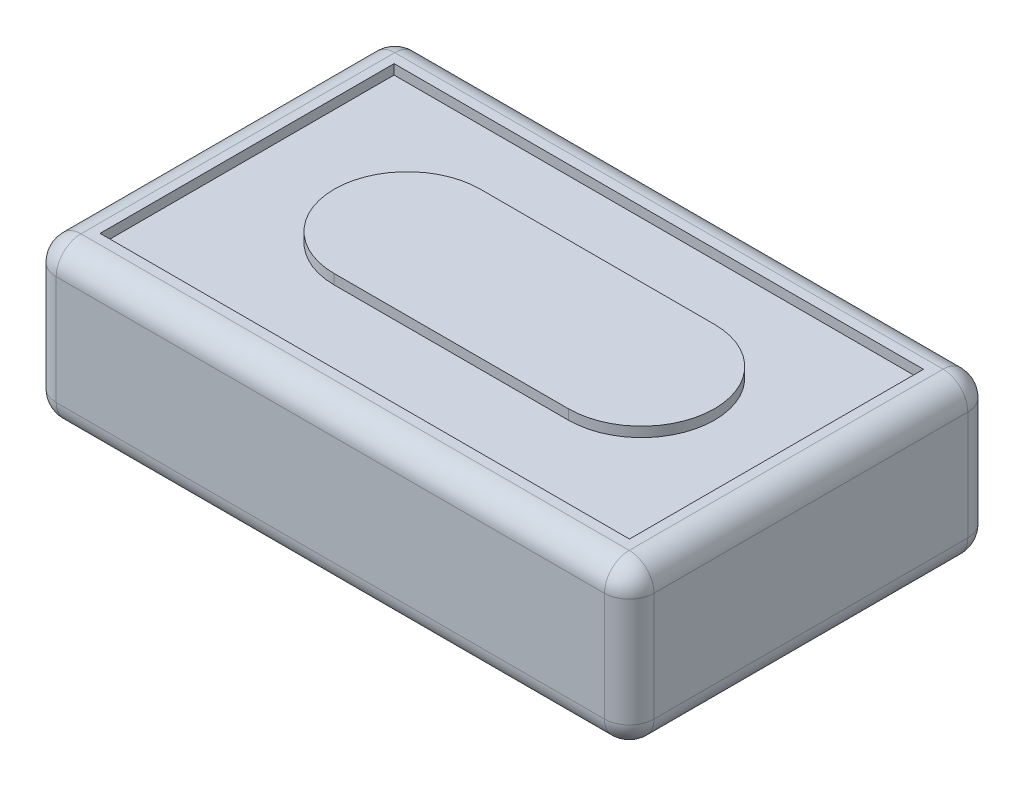
ISO-10303-21;
HEADER;
FILE_DESCRIPTION(('STEP AP214'),'2;1');
FILE_NAME('part.step','',(''),(''),'','','');
FILE_SCHEMA(('AUTOMOTIVE_DESIGN { 1 0 10303 214 1 1 1 1 }'));
ENDSEC;
DATA;
#1=APPLICATION_CONTEXT('core data for automotive mechanical design processes');
#2=APPLICATION_PROTOCOL_DEFINITION('international standard','automotive_design',2000,#1);
#3=PRODUCT_CONTEXT('',#1,'mechanical');
#4=PRODUCT('Part','Part','',(#3));
#5=PRODUCT_RELATED_PRODUCT_CATEGORY('part','',(#4));
#6=PRODUCT_DEFINITION_FORMATION('','',#4);
#7=PRODUCT_DEFINITION_CONTEXT('part definition',#1,'design');
#8=PRODUCT_DEFINITION('design','',#6,#7);
#9=PRODUCT_DEFINITION_SHAPE('','',#8);
#10=(LENGTH_UNIT() NAMED_UNIT(*) SI_UNIT(.MILLI.,.METRE.));
#11=(NAMED_UNIT(*) PLANE_ANGLE_UNIT() SI_UNIT($,.RADIAN.));
#12=(NAMED_UNIT(*) SI_UNIT($,.STERADIAN.) SOLID_ANGLE_UNIT());
#13=UNCERTAINTY_MEASURE_WITH_UNIT(LENGTH_MEASURE(1.E-05),#10,'distance_accuracy_value','');
#14=(GEOMETRIC_REPRESENTATION_CONTEXT(3) GLOBAL_UNCERTAINTY_ASSIGNED_CONTEXT((#13)) GLOBAL_UNIT_ASSIGNED_CONTEXT((#10,
#11,#12)) REPRESENTATION_CONTEXT('',''));
#15=CARTESIAN_POINT('',(0.,0.,0.));
#16=DIRECTION('',(0.,0.,1.));
#17=DIRECTION('',(1.,0.,0.));
#18=AXIS2_PLACEMENT_3D('',#15,#16,#17);
#19=CARTESIAN_POINT('',(0.,30.,0.));
#20=DIRECTION('',(0.,1.,0.));
#21=DIRECTION('',(0.,0.,1.));
#22=AXIS2_PLACEMENT_3D('',#19,#20,#21);
#23=PLANE('',#22);
#24=DIRECTION('',(0.,0.,1.));
#25=VECTOR('',#24,1.);
#26=CARTESIAN_POINT('',(-66.0378786462378,30.,-35.6672184226131));
#27=LINE('',#26,#25);
#28=CARTESIAN_POINT('',(-66.0378786462378,30.,-35.6672184226131));
#29=VERTEX_POINT('',#28);
#30=CARTESIAN_POINT('',(-66.0378786462378,30.,23.697300393735));
#31=VERTEX_POINT('',#30);
#32=EDGE_CURVE('E301',#29,#31,#27,.T.);
#33=ORIENTED_EDGE('',*,*,#32,.T.);
#34=DIRECTION('',(1.,0.,0.));
#35=VECTOR('',#34,1.);
#36=CARTESIAN_POINT('',(-66.0378786462378,30.,23.697300393735));
#37=LINE('',#36,#35);
#38=CARTESIAN_POINT('',(40.8587080469138,30.,23.697300393735));
#39=VERTEX_POINT('',#38);
#40=EDGE_CURVE('E305',#31,#39,#37,.T.);
#41=ORIENTED_EDGE('',*,*,#40,.T.);
#42=DIRECTION('',(0.,0.,-1.));
#43=VECTOR('',#42,1.);
#44=CARTESIAN_POINT('',(40.8587080469138,30.,-35.6672184226131));
#45=LINE('',#44,#43);
#46=CARTESIAN_POINT('',(40.8587080469138,30.,-35.6672184226131));
#47=VERTEX_POINT('',#46);
#48=EDGE_CURVE('E310',#39,#47,#45,.T.);
#49=ORIENTED_EDGE('',*,*,#48,.T.);
#50=DIRECTION('',(-1.,0.,0.));
#51=VECTOR('',#50,1.);
#52=CARTESIAN_POINT('',(-66.0378786462378,30.,-35.6672184226131));
#53=LINE('',#52,#51);
#54=EDGE_CURVE('E314',#47,#29,#53,.T.);
#55=ORIENTED_EDGE('',*,*,#54,.T.);
#56=EDGE_LOOP('',(#33,#41,#49,#55));
#57=FACE_BOUND('',#56,.T.);
#58=DIRECTION('',(1.,0.,0.));
#59=VECTOR('',#58,1.);
#60=CARTESIAN_POINT('',(-35.3748816628657,30.,7.08033888595775));
#61=LINE('',#60,#59);
#62=CARTESIAN_POINT('',(-35.3748816628657,30.,7.08033888595775));
#63=VERTEX_POINT('',#62);
#64=CARTESIAN_POINT('',(11.9074393021383,30.,7.08033888595775));
#65=VERTEX_POINT('',#64);
#66=EDGE_CURVE('E70',#63,#65,#61,.T.);
#67=ORIENTED_EDGE('',*,*,#66,.F.);
#68=CARTESIAN_POINT('',(-35.3748816628657,30.,-7.66977857279566));
#69=DIRECTION('',(0.,1.,0.));
#70=DIRECTION('',(0.,0.,1.));
#71=AXIS2_PLACEMENT_3D('',#68,#69,#70);
#72=CIRCLE('',#71,14.7501174587534);
#73=CARTESIAN_POINT('',(-35.3748816628657,30.,-22.4198960315491));
#74=VERTEX_POINT('',#73);
#75=EDGE_CURVE('E253',#74,#63,#72,.T.);
#76=ORIENTED_EDGE('',*,*,#75,.F.);
#77=DIRECTION('',(1.,0.,0.));
#78=VECTOR('',#77,1.);
#79=CARTESIAN_POINT('',(-35.3748816628657,30.,-22.4198960315491));
#80=LINE('',#79,#78);
#81=CARTESIAN_POINT('',(11.9074393021383,30.,-22.4198960315491));
#82=VERTEX_POINT('',#81);
#83=EDGE_CURVE('E264',#74,#82,#80,.T.);
#84=ORIENTED_EDGE('',*,*,#83,.T.);
#85=CARTESIAN_POINT('',(11.9074393021383,30.,-7.66977857279566));
#86=DIRECTION('',(0.,1.,0.));
#87=DIRECTION('',(0.,0.,1.));
#88=AXIS2_PLACEMENT_3D('',#85,#86,#87);
#89=CIRCLE('',#88,14.7501174587534);
#90=EDGE_CURVE('E280',#65,#82,#89,.T.);
#91=ORIENTED_EDGE('',*,*,#90,.F.);
#92=EDGE_LOOP('',(#67,#76,#84,#91));
#93=FACE_BOUND('',#92,.T.);
#94=ADVANCED_FACE('F44',(#57,#93),#23,.T.);
#95=CARTESIAN_POINT('',(-72.8912329218107,32.,30.7033810699589));
#96=DIRECTION('',(0.,0.,-1.));
#97=DIRECTION('',(-1.,0.,0.));
#98=AXIS2_PLACEMENT_3D('',#95,#96,#97);
#99=PLANE('',#98);
#100=DIRECTION('',(1.,0.,0.));
#101=VECTOR('',#100,1.);
#102=CARTESIAN_POINT('',(-72.8912329218107,27.,30.7033810699589));
#103=LINE('',#102,#101);
#104=CARTESIAN_POINT('',(42.8128987654321,27.,30.7033810699589));
#105=VERTEX_POINT('',#104);
#106=CARTESIAN_POINT('',(-67.8912329218107,27.,30.7033810699589));
#107=VERTEX_POINT('',#106);
#108=EDGE_CURVE('E377',#105,#107,#103,.F.);
#109=ORIENTED_EDGE('',*,*,#108,.T.);
#110=DIRECTION('',(0.,-1.,0.));
#111=VECTOR('',#110,1.);
#112=CARTESIAN_POINT('',(-67.8912329218107,32.,30.7033810699589));
#113=LINE('',#112,#111);
#114=CARTESIAN_POINT('',(-67.8912329218107,5.,30.7033810699589));
#115=VERTEX_POINT('',#114);
#116=EDGE_CURVE('E380',#107,#115,#113,.T.);
#117=ORIENTED_EDGE('',*,*,#116,.T.);
#118=DIRECTION('',(1.,0.,0.));
#119=VECTOR('',#118,1.);
#120=CARTESIAN_POINT('',(47.8128987654321,5.,30.7033810699589));
#121=LINE('',#120,#119);
#122=CARTESIAN_POINT('',(42.8128987654321,5.,30.7033810699589));
#123=VERTEX_POINT('',#122);
#124=EDGE_CURVE('E374',#115,#123,#121,.T.);
#125=ORIENTED_EDGE('',*,*,#124,.T.);
#126=DIRECTION('',(0.,-1.,0.));
#127=VECTOR('',#126,1.);
#128=CARTESIAN_POINT('',(42.8128987654321,32.,30.7033810699589));
#129=LINE('',#128,#127);
#130=EDGE_CURVE('E371',#123,#105,#129,.F.);
#131=ORIENTED_EDGE('',*,*,#130,.T.);
#132=EDGE_LOOP('',(#109,#117,#125,#131));
#133=FACE_BOUND('',#132,.T.);
#134=ADVANCED_FACE('F589',(#133),#99,.F.);
#135=CARTESIAN_POINT('',(47.8128987654321,32.,-42.6566057613168));
#136=DIRECTION('',(1.,0.,0.));
#137=DIRECTION('',(0.,0.,-1.));
#138=AXIS2_PLACEMENT_3D('',#135,#136,#137);
#139=PLANE('',#138);
#140=DIRECTION('',(0.,0.,1.));
#141=VECTOR('',#140,1.);
#142=CARTESIAN_POINT('',(47.8128987654321,27.,30.7033810699589));
#143=LINE('',#142,#141);
#144=CARTESIAN_POINT('',(47.8128987654321,27.,-37.6566057613168));
#145=VERTEX_POINT('',#144);
#146=CARTESIAN_POINT('',(47.8128987654321,27.,25.7033810699589));
#147=VERTEX_POINT('',#146);
#148=EDGE_CURVE('E54',#145,#147,#143,.T.);
#149=ORIENTED_EDGE('',*,*,#148,.T.);
#150=DIRECTION('',(0.,-1.,0.));
#151=VECTOR('',#150,1.);
#152=CARTESIAN_POINT('',(47.8128987654321,0.,25.7033810699589));
#153=LINE('',#152,#151);
#154=CARTESIAN_POINT('',(47.8128987654321,5.,25.7033810699589));
#155=VERTEX_POINT('',#154);
#156=EDGE_CURVE('E11',#147,#155,#153,.T.);
#157=ORIENTED_EDGE('',*,*,#156,.T.);
#158=DIRECTION('',(0.,0.,1.));
#159=VECTOR('',#158,1.);
#160=CARTESIAN_POINT('',(47.8128987654321,5.,-42.6566057613168));
#161=LINE('',#160,#159);
#162=CARTESIAN_POINT('',(47.8128987654321,5.,-37.6566057613168));
#163=VERTEX_POINT('',#162);
#164=EDGE_CURVE('E410',#155,#163,#161,.F.);
#165=ORIENTED_EDGE('',*,*,#164,.T.);
#166=DIRECTION('',(0.,-1.,0.));
#167=VECTOR('',#166,1.);
#168=CARTESIAN_POINT('',(47.8128987654321,32.,-37.6566057613168));
#169=LINE('',#168,#167);
#170=EDGE_CURVE('E413',#163,#145,#169,.F.);
#171=ORIENTED_EDGE('',*,*,#170,.T.);
#172=EDGE_LOOP('',(#149,#157,#165,#171));
#173=FACE_BOUND('',#172,.T.);
#174=ADVANCED_FACE('F532',(#173),#139,.T.);
#175=CARTESIAN_POINT('',(-72.8912329218107,32.,-42.6566057613168));
#176=DIRECTION('',(0.,0.,-1.));
#177=DIRECTION('',(-1.,0.,0.));
#178=AXIS2_PLACEMENT_3D('',#175,#176,#177);
#179=PLANE('',#178);
#180=DIRECTION('',(0.,-1.,0.));
#181=VECTOR('',#180,1.);
#182=CARTESIAN_POINT('',(-67.8912329218107,32.,-42.6566057613168));
#183=LINE('',#182,#181);
#184=CARTESIAN_POINT('',(-67.8912329218107,5.,-42.6566057613168));
#185=VERTEX_POINT('',#184);
#186=CARTESIAN_POINT('',(-67.8912329218107,27.,-42.6566057613168));
#187=VERTEX_POINT('',#186);
#188=EDGE_CURVE('E403',#185,#187,#183,.F.);
#189=ORIENTED_EDGE('',*,*,#188,.T.);
#190=DIRECTION('',(1.,0.,0.));
#191=VECTOR('',#190,1.);
#192=CARTESIAN_POINT('',(47.8128987654321,27.,-42.6566057613168));
#193=LINE('',#192,#191);
#194=CARTESIAN_POINT('',(42.8128987654321,27.,-42.6566057613168));
#195=VERTEX_POINT('',#194);
#196=EDGE_CURVE('E406',#187,#195,#193,.T.);
#197=ORIENTED_EDGE('',*,*,#196,.T.);
#198=DIRECTION('',(0.,-1.,0.));
#199=VECTOR('',#198,1.);
#200=CARTESIAN_POINT('',(42.8128987654321,32.,-42.6566057613168));
#201=LINE('',#200,#199);
#202=CARTESIAN_POINT('',(42.8128987654321,5.,-42.6566057613168));
#203=VERTEX_POINT('',#202);
#204=EDGE_CURVE('E397',#195,#203,#201,.T.);
#205=ORIENTED_EDGE('',*,*,#204,.T.);
#206=DIRECTION('',(1.,0.,0.));
#207=VECTOR('',#206,1.);
#208=CARTESIAN_POINT('',(-72.8912329218107,5.,-42.6566057613168));
#209=LINE('',#208,#207);
#210=EDGE_CURVE('E400',#203,#185,#209,.F.);
#211=ORIENTED_EDGE('',*,*,#210,.T.);
#212=EDGE_LOOP('',(#189,#197,#205,#211));
#213=FACE_BOUND('',#212,.T.);
#214=ADVANCED_FACE('F523',(#213),#179,.T.);
#215=CARTESIAN_POINT('',(-72.8912329218107,32.,-42.6566057613168));
#216=DIRECTION('',(1.,0.,0.));
#217=DIRECTION('',(0.,0.,-1.));
#218=AXIS2_PLACEMENT_3D('',#215,#216,#217);
#219=PLANE('',#218);
#220=DIRECTION('',(0.,-1.,0.));
#221=VECTOR('',#220,1.);
#222=CARTESIAN_POINT('',(-72.8912329218107,32.,25.7033810699589));
#223=LINE('',#222,#221);
#224=CARTESIAN_POINT('',(-72.8912329218107,5.,25.7033810699589));
#225=VERTEX_POINT('',#224);
#226=CARTESIAN_POINT('',(-72.8912329218107,27.,25.7033810699589));
#227=VERTEX_POINT('',#226);
#228=EDGE_CURVE('E364',#225,#227,#223,.F.);
#229=ORIENTED_EDGE('',*,*,#228,.T.);
#230=DIRECTION('',(0.,0.,1.));
#231=VECTOR('',#230,1.);
#232=CARTESIAN_POINT('',(-72.8912329218107,27.,-42.6566057613168));
#233=LINE('',#232,#231);
#234=CARTESIAN_POINT('',(-72.8912329218107,27.,-37.6566057613168));
#235=VERTEX_POINT('',#234);
#236=EDGE_CURVE('E367',#227,#235,#233,.F.);
#237=ORIENTED_EDGE('',*,*,#236,.T.);
#238=DIRECTION('',(0.,-1.,0.));
#239=VECTOR('',#238,1.);
#240=CARTESIAN_POINT('',(-72.8912329218107,0.,-37.6566057613168));
#241=LINE('',#240,#239);
#242=CARTESIAN_POINT('',(-72.8912329218107,5.,-37.6566057613168));
#243=VERTEX_POINT('',#242);
#244=EDGE_CURVE('E358',#235,#243,#241,.T.);
#245=ORIENTED_EDGE('',*,*,#244,.T.);
#246=DIRECTION('',(0.,0.,1.));
#247=VECTOR('',#246,1.);
#248=CARTESIAN_POINT('',(-72.8912329218107,5.,30.7033810699589));
#249=LINE('',#248,#247);
#250=EDGE_CURVE('E361',#243,#225,#249,.T.);
#251=ORIENTED_EDGE('',*,*,#250,.T.);
#252=EDGE_LOOP('',(#229,#237,#245,#251));
#253=FACE_BOUND('',#252,.T.);
#254=ADVANCED_FACE('F621',(#253),#219,.F.);
#255=CARTESIAN_POINT('',(0.,32.,0.));
#256=DIRECTION('',(0.,-1.,0.));
#257=DIRECTION('',(0.,0.,-1.));
#258=AXIS2_PLACEMENT_3D('',#255,#256,#257);
#259=PLANE('',#258);
#260=DIRECTION('',(1.,0.,0.));
#261=VECTOR('',#260,1.);
#262=CARTESIAN_POINT('',(-66.0378786462378,32.,23.697300393735));
#263=LINE('',#262,#261);
#264=CARTESIAN_POINT('',(-66.0378786462378,32.,23.697300393735));
#265=VERTEX_POINT('',#264);
#266=CARTESIAN_POINT('',(40.8587080469138,32.,23.697300393735));
#267=VERTEX_POINT('',#266);
#268=EDGE_CURVE('E321',#265,#267,#263,.T.);
#269=ORIENTED_EDGE('',*,*,#268,.F.);
#270=DIRECTION('',(0.,0.,1.));
#271=VECTOR('',#270,1.);
#272=CARTESIAN_POINT('',(-66.0378786462378,32.,-35.6672184226131));
#273=LINE('',#272,#271);
#274=CARTESIAN_POINT('',(-66.0378786462378,32.,-35.6672184226131));
#275=VERTEX_POINT('',#274);
#276=EDGE_CURVE('E300',#275,#265,#273,.T.);
#277=ORIENTED_EDGE('',*,*,#276,.F.);
#278=DIRECTION('',(-1.,0.,0.));
#279=VECTOR('',#278,1.);
#280=CARTESIAN_POINT('',(-66.0378786462378,32.,-35.6672184226131));
#281=LINE('',#280,#279);
#282=CARTESIAN_POINT('',(40.8587080469138,32.,-35.6672184226131));
#283=VERTEX_POINT('',#282);
#284=EDGE_CURVE('E306',#283,#275,#281,.T.);
#285=ORIENTED_EDGE('',*,*,#284,.F.);
#286=DIRECTION('',(0.,0.,-1.));
#287=VECTOR('',#286,1.);
#288=CARTESIAN_POINT('',(40.8587080469138,32.,-35.6672184226131));
#289=LINE('',#288,#287);
#290=EDGE_CURVE('E325',#267,#283,#289,.T.);
#291=ORIENTED_EDGE('',*,*,#290,.F.);
#292=EDGE_LOOP('',(#269,#277,#285,#291));
#293=FACE_BOUND('',#292,.T.);
#294=DIRECTION('',(1.,0.,0.));
#295=VECTOR('',#294,1.);
#296=CARTESIAN_POINT('',(-72.8912329218107,32.,-37.6566057613168));
#297=LINE('',#296,#295);
#298=CARTESIAN_POINT('',(42.8128987654321,32.,-37.6566057613168));
#299=VERTEX_POINT('',#298);
#300=CARTESIAN_POINT('',(-67.8912329218107,32.,-37.6566057613168));
#301=VERTEX_POINT('',#300);
#302=EDGE_CURVE('E348',#299,#301,#297,.F.);
#303=ORIENTED_EDGE('',*,*,#302,.T.);
#304=DIRECTION('',(0.,0.,1.));
#305=VECTOR('',#304,1.);
#306=CARTESIAN_POINT('',(-67.8912329218107,32.,0.));
#307=LINE('',#306,#305);
#308=CARTESIAN_POINT('',(-67.8912329218107,32.,25.7033810699589));
#309=VERTEX_POINT('',#308);
#310=EDGE_CURVE('E354',#301,#309,#307,.T.);
#311=ORIENTED_EDGE('',*,*,#310,.T.);
#312=DIRECTION('',(1.,0.,0.));
#313=VECTOR('',#312,1.);
#314=CARTESIAN_POINT('',(0.,32.,25.7033810699589));
#315=LINE('',#314,#313);
#316=CARTESIAN_POINT('',(42.8128987654321,32.,25.7033810699589));
#317=VERTEX_POINT('',#316);
#318=EDGE_CURVE('E351',#309,#317,#315,.T.);
#319=ORIENTED_EDGE('',*,*,#318,.T.);
#320=DIRECTION('',(0.,0.,1.));
#321=VECTOR('',#320,1.);
#322=CARTESIAN_POINT('',(42.8128987654321,32.,-42.6566057613168));
#323=LINE('',#322,#321);
#324=EDGE_CURVE('E345',#317,#299,#323,.F.);
#325=ORIENTED_EDGE('',*,*,#324,.T.);
#326=EDGE_LOOP('',(#303,#311,#319,#325));
#327=FACE_BOUND('',#326,.T.);
#328=ADVANCED_FACE('F618',(#293,#327),#259,.F.);
#329=CARTESIAN_POINT('',(0.,0.,0.));
#330=DIRECTION('',(0.,-1.,0.));
#331=DIRECTION('',(0.,0.,-1.));
#332=AXIS2_PLACEMENT_3D('',#329,#330,#331);
#333=PLANE('',#332);
#334=DIRECTION('',(0.,0.,-1.));
#335=VECTOR('',#334,1.);
#336=CARTESIAN_POINT('',(-66.1540366843682,0.,23.8031666764886));
#337=LINE('',#336,#335);
#338=CARTESIAN_POINT('',(-66.1540366843682,0.,23.8031666764886));
#339=VERTEX_POINT('',#338);
#340=CARTESIAN_POINT('',(-66.1540366843682,0.,-35.7253025064288));
#341=VERTEX_POINT('',#340);
#342=EDGE_CURVE('E62',#339,#341,#337,.T.);
#343=ORIENTED_EDGE('',*,*,#342,.F.);
#344=DIRECTION('',(-1.,0.,0.));
#345=VECTOR('',#344,1.);
#346=CARTESIAN_POINT('',(-66.1540366843682,0.,23.8031666764886));
#347=LINE('',#346,#345);
#348=CARTESIAN_POINT('',(41.1210844637195,0.,23.8031666764886));
#349=VERTEX_POINT('',#348);
#350=EDGE_CURVE('E231',#349,#339,#347,.T.);
#351=ORIENTED_EDGE('',*,*,#350,.F.);
#352=DIRECTION('',(0.,0.,1.));
#353=VECTOR('',#352,1.);
#354=CARTESIAN_POINT('',(41.1210844637195,0.,23.8031666764886));
#355=LINE('',#354,#353);
#356=CARTESIAN_POINT('',(41.1210844637195,0.,-35.7253025064288));
#357=VERTEX_POINT('',#356);
#358=EDGE_CURVE('E235',#357,#349,#355,.T.);
#359=ORIENTED_EDGE('',*,*,#358,.F.);
#360=DIRECTION('',(1.,0.,0.));
#361=VECTOR('',#360,1.);
#362=CARTESIAN_POINT('',(-66.1540366843682,0.,-35.7253025064288));
#363=LINE('',#362,#361);
#364=EDGE_CURVE('E244',#341,#357,#363,.T.);
#365=ORIENTED_EDGE('',*,*,#364,.F.);
#366=EDGE_LOOP('',(#343,#351,#359,#365));
#367=FACE_BOUND('',#366,.T.);
#368=DIRECTION('',(1.,0.,0.));
#369=VECTOR('',#368,1.);
#370=CARTESIAN_POINT('',(-72.8912329218107,0.,25.7033810699589));
#371=LINE('',#370,#369);
#372=CARTESIAN_POINT('',(42.8128987654321,0.,25.7033810699589));
#373=VERTEX_POINT('',#372);
#374=CARTESIAN_POINT('',(-67.8912329218107,0.,25.7033810699589));
#375=VERTEX_POINT('',#374);
#376=EDGE_CURVE('E390',#373,#375,#371,.F.);
#377=ORIENTED_EDGE('',*,*,#376,.T.);
#378=DIRECTION('',(0.,0.,1.));
#379=VECTOR('',#378,1.);
#380=CARTESIAN_POINT('',(-67.8912329218107,0.,-42.6566057613168));
#381=LINE('',#380,#379);
#382=CARTESIAN_POINT('',(-67.8912329218107,0.,-37.6566057613168));
#383=VERTEX_POINT('',#382);
#384=EDGE_CURVE('E393',#375,#383,#381,.F.);
#385=ORIENTED_EDGE('',*,*,#384,.T.);
#386=DIRECTION('',(1.,0.,0.));
#387=VECTOR('',#386,1.);
#388=CARTESIAN_POINT('',(0.,0.,-37.6566057613168));
#389=LINE('',#388,#387);
#390=CARTESIAN_POINT('',(42.8128987654321,0.,-37.6566057613168));
#391=VERTEX_POINT('',#390);
#392=EDGE_CURVE('E387',#383,#391,#389,.T.);
#393=ORIENTED_EDGE('',*,*,#392,.T.);
#394=DIRECTION('',(0.,0.,1.));
#395=VECTOR('',#394,1.);
#396=CARTESIAN_POINT('',(42.8128987654321,0.,0.));
#397=LINE('',#396,#395);
#398=EDGE_CURVE('E384',#391,#373,#397,.T.);
#399=ORIENTED_EDGE('',*,*,#398,.T.);
#400=EDGE_LOOP('',(#377,#385,#393,#399));
#401=FACE_BOUND('',#400,.T.);
#402=ADVANCED_FACE('F556',(#367,#401),#333,.T.);
#403=CARTESIAN_POINT('',(42.8128987654321,5.,0.));
#404=DIRECTION('',(0.,0.,1.));
#405=DIRECTION('',(1.,0.,0.));
#406=AXIS2_PLACEMENT_3D('',#403,#404,#405);
#407=CYLINDRICAL_SURFACE('',#406,5.);
#408=CARTESIAN_POINT('',(42.8128987654321,5.,-37.6566057613168));
#409=DIRECTION('',(0.,0.,-1.));
#410=DIRECTION('',(-1.,0.,0.));
#411=AXIS2_PLACEMENT_3D('',#408,#409,#410);
#412=CIRCLE('',#411,5.);
#413=EDGE_CURVE('E48',#163,#391,#412,.T.);
#414=ORIENTED_EDGE('',*,*,#413,.F.);
#415=ORIENTED_EDGE('',*,*,#164,.F.);
#416=CARTESIAN_POINT('',(42.8128987654321,5.,25.7033810699589));
#417=DIRECTION('',(0.,0.,1.));
#418=DIRECTION('',(1.,0.,0.));
#419=AXIS2_PLACEMENT_3D('',#416,#417,#418);
#420=CIRCLE('',#419,5.);
#421=EDGE_CURVE('E498',#373,#155,#420,.T.);
#422=ORIENTED_EDGE('',*,*,#421,.F.);
#423=ORIENTED_EDGE('',*,*,#398,.F.);
#424=EDGE_LOOP('',(#414,#415,#422,#423));
#425=FACE_BOUND('',#424,.T.);
#426=ADVANCED_FACE('F46',(#425),#407,.T.);
#427=CARTESIAN_POINT('',(42.8128987654321,5.,-37.6566057613168));
#428=DIRECTION('',(0.,-1.,0.));
#429=DIRECTION('',(0.,0.,-1.));
#430=AXIS2_PLACEMENT_3D('',#427,#428,#429);
#431=SPHERICAL_SURFACE('',#430,5.);
#432=CARTESIAN_POINT('',(42.8128987654321,5.,-37.6566057613168));
#433=DIRECTION('',(0.,-1.,0.));
#434=DIRECTION('',(0.,0.,-1.));
#435=AXIS2_PLACEMENT_3D('',#432,#433,#434);
#436=CIRCLE('',#435,5.);
#437=EDGE_CURVE('E491',#163,#203,#436,.F.);
#438=ORIENTED_EDGE('',*,*,#437,.F.);
#439=ORIENTED_EDGE('',*,*,#413,.T.);
#440=CARTESIAN_POINT('',(42.8128987654321,5.,-37.6566057613168));
#441=DIRECTION('',(1.,0.,0.));
#442=DIRECTION('',(0.,0.,-1.));
#443=AXIS2_PLACEMENT_3D('',#440,#441,#442);
#444=CIRCLE('',#443,5.);
#445=EDGE_CURVE('E495',#203,#391,#444,.F.);
#446=ORIENTED_EDGE('',*,*,#445,.F.);
#447=EDGE_LOOP('',(#438,#439,#446));
#448=FACE_BOUND('',#447,.T.);
#449=ADVANCED_FACE('F512',(#448),#431,.T.);
#450=CARTESIAN_POINT('',(42.8128987654321,5.,25.7033810699589));
#451=DIRECTION('',(1.,0.,0.));
#452=DIRECTION('',(0.,0.,-1.));
#453=AXIS2_PLACEMENT_3D('',#450,#451,#452);
#454=SPHERICAL_SURFACE('',#453,5.);
#455=CARTESIAN_POINT('',(42.8128987654321,5.,25.7033810699589));
#456=DIRECTION('',(1.,0.,0.));
#457=DIRECTION('',(0.,0.,-1.));
#458=AXIS2_PLACEMENT_3D('',#455,#456,#457);
#459=CIRCLE('',#458,5.);
#460=EDGE_CURVE('E484',#373,#123,#459,.F.);
#461=ORIENTED_EDGE('',*,*,#460,.F.);
#462=ORIENTED_EDGE('',*,*,#421,.T.);
#463=CARTESIAN_POINT('',(42.8128987654321,5.,25.7033810699589));
#464=DIRECTION('',(0.,-1.,0.));
#465=DIRECTION('',(0.,0.,-1.));
#466=AXIS2_PLACEMENT_3D('',#463,#464,#465);
#467=CIRCLE('',#466,5.);
#468=EDGE_CURVE('E488',#123,#155,#467,.F.);
#469=ORIENTED_EDGE('',*,*,#468,.F.);
#470=EDGE_LOOP('',(#461,#462,#469));
#471=FACE_BOUND('',#470,.T.);
#472=ADVANCED_FACE('F548',(#471),#454,.T.);
#473=CARTESIAN_POINT('',(0.,5.,-37.6566057613168));
#474=DIRECTION('',(1.,0.,0.));
#475=DIRECTION('',(0.,0.,-1.));
#476=AXIS2_PLACEMENT_3D('',#473,#474,#475);
#477=CYLINDRICAL_SURFACE('',#476,5.);
#478=ORIENTED_EDGE('',*,*,#445,.T.);
#479=ORIENTED_EDGE('',*,*,#392,.F.);
#480=CARTESIAN_POINT('',(-67.8912329218107,5.,-37.6566057613168));
#481=DIRECTION('',(-1.,0.,0.));
#482=DIRECTION('',(0.,0.,1.));
#483=AXIS2_PLACEMENT_3D('',#480,#481,#482);
#484=CIRCLE('',#483,5.);
#485=EDGE_CURVE('E477',#185,#383,#484,.T.);
#486=ORIENTED_EDGE('',*,*,#485,.F.);
#487=ORIENTED_EDGE('',*,*,#210,.F.);
#488=EDGE_LOOP('',(#478,#479,#486,#487));
#489=FACE_BOUND('',#488,.T.);
#490=ADVANCED_FACE('F519',(#489),#477,.T.);
#491=CARTESIAN_POINT('',(42.8128987654321,32.,-37.6566057613168));
#492=DIRECTION('',(0.,-1.,0.));
#493=DIRECTION('',(0.,0.,-1.));
#494=AXIS2_PLACEMENT_3D('',#491,#492,#493);
#495=CYLINDRICAL_SURFACE('',#494,5.);
#496=ORIENTED_EDGE('',*,*,#437,.T.);
#497=ORIENTED_EDGE('',*,*,#204,.F.);
#498=CARTESIAN_POINT('',(42.8128987654321,27.,-37.6566057613168));
#499=DIRECTION('',(0.,1.,0.));
#500=DIRECTION('',(0.,0.,1.));
#501=AXIS2_PLACEMENT_3D('',#498,#499,#500);
#502=CIRCLE('',#501,5.);
#503=EDGE_CURVE('E473',#145,#195,#502,.T.);
#504=ORIENTED_EDGE('',*,*,#503,.F.);
#505=ORIENTED_EDGE('',*,*,#170,.F.);
#506=EDGE_LOOP('',(#496,#497,#504,#505));
#507=FACE_BOUND('',#506,.T.);
#508=ADVANCED_FACE('F529',(#507),#495,.T.);
#509=CARTESIAN_POINT('',(42.8128987654321,27.,-42.6566057613168));
#510=DIRECTION('',(0.,0.,-1.));
#511=DIRECTION('',(-1.,0.,0.));
#512=AXIS2_PLACEMENT_3D('',#509,#510,#511);
#513=CYLINDRICAL_SURFACE('',#512,5.);
#514=CARTESIAN_POINT('',(42.8128987654321,27.,25.7033810699589));
#515=DIRECTION('',(0.,0.,1.));
#516=DIRECTION('',(0.,-1.,0.));
#517=AXIS2_PLACEMENT_3D('',#514,#515,#516);
#518=CIRCLE('',#517,5.);
#519=EDGE_CURVE('E465',#147,#317,#518,.T.);
#520=ORIENTED_EDGE('',*,*,#519,.F.);
#521=ORIENTED_EDGE('',*,*,#148,.F.);
#522=CARTESIAN_POINT('',(42.8128987654321,27.,-37.6566057613168));
#523=DIRECTION('',(0.,0.,-1.));
#524=DIRECTION('',(-1.,0.,0.));
#525=AXIS2_PLACEMENT_3D('',#522,#523,#524);
#526=CIRCLE('',#525,5.);
#527=EDGE_CURVE('E469',#299,#145,#526,.T.);
#528=ORIENTED_EDGE('',*,*,#527,.F.);
#529=ORIENTED_EDGE('',*,*,#324,.F.);
#530=EDGE_LOOP('',(#520,#521,#528,#529));
#531=FACE_BOUND('',#530,.T.);
#532=ADVANCED_FACE('F537',(#531),#513,.T.);
#533=CARTESIAN_POINT('',(42.8128987654321,32.,25.7033810699589));
#534=DIRECTION('',(0.,1.,0.));
#535=DIRECTION('',(0.,0.,1.));
#536=AXIS2_PLACEMENT_3D('',#533,#534,#535);
#537=CYLINDRICAL_SURFACE('',#536,5.);
#538=ORIENTED_EDGE('',*,*,#468,.T.);
#539=ORIENTED_EDGE('',*,*,#156,.F.);
#540=CARTESIAN_POINT('',(42.8128987654321,27.,25.7033810699589));
#541=DIRECTION('',(0.,1.,0.));
#542=DIRECTION('',(0.,0.,1.));
#543=AXIS2_PLACEMENT_3D('',#540,#541,#542);
#544=CIRCLE('',#543,5.);
#545=EDGE_CURVE('E461',#105,#147,#544,.T.);
#546=ORIENTED_EDGE('',*,*,#545,.F.);
#547=ORIENTED_EDGE('',*,*,#130,.F.);
#548=EDGE_LOOP('',(#538,#539,#546,#547));
#549=FACE_BOUND('',#548,.T.);
#550=ADVANCED_FACE('F547',(#549),#537,.T.);
#551=CARTESIAN_POINT('',(-72.8912329218107,5.,25.7033810699589));
#552=DIRECTION('',(-1.,0.,0.));
#553=DIRECTION('',(0.,0.,1.));
#554=AXIS2_PLACEMENT_3D('',#551,#552,#553);
#555=CYLINDRICAL_SURFACE('',#554,5.);
#556=ORIENTED_EDGE('',*,*,#460,.T.);
#557=ORIENTED_EDGE('',*,*,#124,.F.);
#558=CARTESIAN_POINT('',(-67.8912329218107,5.,25.7033810699589));
#559=DIRECTION('',(-1.,0.,0.));
#560=DIRECTION('',(0.,0.,1.));
#561=AXIS2_PLACEMENT_3D('',#558,#559,#560);
#562=CIRCLE('',#561,5.);
#563=EDGE_CURVE('E457',#375,#115,#562,.T.);
#564=ORIENTED_EDGE('',*,*,#563,.F.);
#565=ORIENTED_EDGE('',*,*,#376,.F.);
#566=EDGE_LOOP('',(#556,#557,#564,#565));
#567=FACE_BOUND('',#566,.T.);
#568=ADVANCED_FACE('F553',(#567),#555,.T.);
#569=CARTESIAN_POINT('',(-67.8912329218107,5.,-42.6566057613168));
#570=DIRECTION('',(0.,0.,-1.));
#571=DIRECTION('',(-1.,0.,0.));
#572=AXIS2_PLACEMENT_3D('',#569,#570,#571);
#573=CYLINDRICAL_SURFACE('',#572,5.);
#574=CARTESIAN_POINT('',(-67.8912329218107,5.,-37.6566057613168));
#575=DIRECTION('',(0.,0.,-1.));
#576=DIRECTION('',(-1.,0.,0.));
#577=AXIS2_PLACEMENT_3D('',#574,#575,#576);
#578=CIRCLE('',#577,5.);
#579=EDGE_CURVE('E480',#383,#243,#578,.T.);
#580=ORIENTED_EDGE('',*,*,#579,.F.);
#581=ORIENTED_EDGE('',*,*,#384,.F.);
#582=CARTESIAN_POINT('',(-67.8912329218107,5.,25.7033810699589));
#583=DIRECTION('',(0.,0.,1.));
#584=DIRECTION('',(1.,0.,0.));
#585=AXIS2_PLACEMENT_3D('',#582,#583,#584);
#586=CIRCLE('',#585,5.);
#587=EDGE_CURVE('E453',#225,#375,#586,.T.);
#588=ORIENTED_EDGE('',*,*,#587,.F.);
#589=ORIENTED_EDGE('',*,*,#250,.F.);
#590=EDGE_LOOP('',(#580,#581,#588,#589));
#591=FACE_BOUND('',#590,.T.);
#592=ADVANCED_FACE('F560',(#591),#573,.T.);
#593=CARTESIAN_POINT('',(-67.8912329218107,5.,-37.6566057613168));
#594=DIRECTION('',(0.,-1.,0.));
#595=DIRECTION('',(0.,0.,-1.));
#596=AXIS2_PLACEMENT_3D('',#593,#594,#595);
#597=SPHERICAL_SURFACE('',#596,5.);
#598=ORIENTED_EDGE('',*,*,#485,.T.);
#599=ORIENTED_EDGE('',*,*,#579,.T.);
#600=CARTESIAN_POINT('',(-67.8912329218107,5.,-37.6566057613168));
#601=DIRECTION('',(0.,-1.,0.));
#602=DIRECTION('',(0.,0.,-1.));
#603=AXIS2_PLACEMENT_3D('',#600,#601,#602);
#604=CIRCLE('',#603,5.);
#605=EDGE_CURVE('E449',#185,#243,#604,.F.);
#606=ORIENTED_EDGE('',*,*,#605,.F.);
#607=EDGE_LOOP('',(#598,#599,#606));
#608=FACE_BOUND('',#607,.T.);
#609=ADVANCED_FACE('F564',(#608),#597,.T.);
#610=CARTESIAN_POINT('',(42.8128987654321,27.,-37.6566057613168));
#611=DIRECTION('',(1.,0.,0.));
#612=DIRECTION('',(0.,0.,-1.));
#613=AXIS2_PLACEMENT_3D('',#610,#611,#612);
#614=SPHERICAL_SURFACE('',#613,5.);
#615=ORIENTED_EDGE('',*,*,#527,.T.);
#616=ORIENTED_EDGE('',*,*,#503,.T.);
#617=CARTESIAN_POINT('',(42.8128987654321,27.,-37.6566057613168));
#618=DIRECTION('',(1.,0.,0.));
#619=DIRECTION('',(0.,1.,0.));
#620=AXIS2_PLACEMENT_3D('',#617,#618,#619);
#621=CIRCLE('',#620,5.);
#622=EDGE_CURVE('E446',#299,#195,#621,.F.);
#623=ORIENTED_EDGE('',*,*,#622,.F.);
#624=EDGE_LOOP('',(#615,#616,#623));
#625=FACE_BOUND('',#624,.T.);
#626=ADVANCED_FACE('F578',(#625),#614,.T.);
#627=CARTESIAN_POINT('',(42.8128987654321,27.,25.7033810699589));
#628=DIRECTION('',(1.,0.,0.));
#629=DIRECTION('',(0.,0.,-1.));
#630=AXIS2_PLACEMENT_3D('',#627,#628,#629);
#631=SPHERICAL_SURFACE('',#630,5.);
#632=ORIENTED_EDGE('',*,*,#545,.T.);
#633=ORIENTED_EDGE('',*,*,#519,.T.);
#634=CARTESIAN_POINT('',(42.8128987654321,27.,25.7033810699589));
#635=DIRECTION('',(1.,0.,0.));
#636=DIRECTION('',(0.,0.,-1.));
#637=AXIS2_PLACEMENT_3D('',#634,#635,#636);
#638=CIRCLE('',#637,5.);
#639=EDGE_CURVE('E442',#105,#317,#638,.F.);
#640=ORIENTED_EDGE('',*,*,#639,.F.);
#641=EDGE_LOOP('',(#632,#633,#640));
#642=FACE_BOUND('',#641,.T.);
#643=ADVANCED_FACE('F543',(#642),#631,.T.);
#644=CARTESIAN_POINT('',(-67.8912329218107,5.,25.7033810699589));
#645=DIRECTION('',(0.,-1.,0.));
#646=DIRECTION('',(0.,0.,-1.));
#647=AXIS2_PLACEMENT_3D('',#644,#645,#646);
#648=SPHERICAL_SURFACE('',#647,5.);
#649=ORIENTED_EDGE('',*,*,#587,.T.);
#650=ORIENTED_EDGE('',*,*,#563,.T.);
#651=CARTESIAN_POINT('',(-67.8912329218107,5.,25.7033810699589));
#652=DIRECTION('',(0.,-1.,0.));
#653=DIRECTION('',(0.,0.,-1.));
#654=AXIS2_PLACEMENT_3D('',#651,#652,#653);
#655=CIRCLE('',#654,5.);
#656=EDGE_CURVE('E439',#225,#115,#655,.F.);
#657=ORIENTED_EDGE('',*,*,#656,.F.);
#658=EDGE_LOOP('',(#649,#650,#657));
#659=FACE_BOUND('',#658,.T.);
#660=ADVANCED_FACE('F585',(#659),#648,.T.);
#661=CARTESIAN_POINT('',(-67.8912329218107,32.,-37.6566057613168));
#662=DIRECTION('',(0.,1.,0.));
#663=DIRECTION('',(0.,0.,1.));
#664=AXIS2_PLACEMENT_3D('',#661,#662,#663);
#665=CYLINDRICAL_SURFACE('',#664,5.);
#666=ORIENTED_EDGE('',*,*,#605,.T.);
#667=ORIENTED_EDGE('',*,*,#244,.F.);
#668=CARTESIAN_POINT('',(-67.8912329218107,27.,-37.6566057613168));
#669=DIRECTION('',(0.,1.,0.));
#670=DIRECTION('',(0.,0.,1.));
#671=AXIS2_PLACEMENT_3D('',#668,#669,#670);
#672=CIRCLE('',#671,5.);
#673=EDGE_CURVE('E435',#187,#235,#672,.T.);
#674=ORIENTED_EDGE('',*,*,#673,.F.);
#675=ORIENTED_EDGE('',*,*,#188,.F.);
#676=EDGE_LOOP('',(#666,#667,#674,#675));
#677=FACE_BOUND('',#676,.T.);
#678=ADVANCED_FACE('F567',(#677),#665,.T.);
#679=CARTESIAN_POINT('',(-72.8912329218107,27.,-37.6566057613168));
#680=DIRECTION('',(-1.,0.,0.));
#681=DIRECTION('',(0.,0.,1.));
#682=AXIS2_PLACEMENT_3D('',#679,#680,#681);
#683=CYLINDRICAL_SURFACE('',#682,5.);
#684=ORIENTED_EDGE('',*,*,#622,.T.);
#685=ORIENTED_EDGE('',*,*,#196,.F.);
#686=CARTESIAN_POINT('',(-67.8912329218107,27.,-37.6566057613168));
#687=DIRECTION('',(-1.,0.,0.));
#688=DIRECTION('',(0.,0.,1.));
#689=AXIS2_PLACEMENT_3D('',#686,#687,#688);
#690=CIRCLE('',#689,5.);
#691=EDGE_CURVE('E431',#301,#187,#690,.T.);
#692=ORIENTED_EDGE('',*,*,#691,.F.);
#693=ORIENTED_EDGE('',*,*,#302,.F.);
#694=EDGE_LOOP('',(#684,#685,#692,#693));
#695=FACE_BOUND('',#694,.T.);
#696=ADVANCED_FACE('F576',(#695),#683,.T.);
#697=CARTESIAN_POINT('',(0.,27.,25.7033810699589));
#698=DIRECTION('',(1.,0.,0.));
#699=DIRECTION('',(0.,0.,-1.));
#700=AXIS2_PLACEMENT_3D('',#697,#698,#699);
#701=CYLINDRICAL_SURFACE('',#700,5.);
#702=ORIENTED_EDGE('',*,*,#639,.T.);
#703=ORIENTED_EDGE('',*,*,#318,.F.);
#704=CARTESIAN_POINT('',(-67.8912329218107,27.,25.7033810699589));
#705=DIRECTION('',(-1.,0.,0.));
#706=DIRECTION('',(0.,0.,1.));
#707=AXIS2_PLACEMENT_3D('',#704,#705,#706);
#708=CIRCLE('',#707,5.);
#709=EDGE_CURVE('E427',#107,#309,#708,.T.);
#710=ORIENTED_EDGE('',*,*,#709,.F.);
#711=ORIENTED_EDGE('',*,*,#108,.F.);
#712=EDGE_LOOP('',(#702,#703,#710,#711));
#713=FACE_BOUND('',#712,.T.);
#714=ADVANCED_FACE('F645',(#713),#701,.T.);
#715=CARTESIAN_POINT('',(-67.8912329218107,32.,25.7033810699589));
#716=DIRECTION('',(0.,-1.,0.));
#717=DIRECTION('',(0.,0.,-1.));
#718=AXIS2_PLACEMENT_3D('',#715,#716,#717);
#719=CYLINDRICAL_SURFACE('',#718,5.);
#720=ORIENTED_EDGE('',*,*,#656,.T.);
#721=ORIENTED_EDGE('',*,*,#116,.F.);
#722=CARTESIAN_POINT('',(-67.8912329218107,27.,25.7033810699589));
#723=DIRECTION('',(0.,1.,0.));
#724=DIRECTION('',(0.,0.,1.));
#725=AXIS2_PLACEMENT_3D('',#722,#723,#724);
#726=CIRCLE('',#725,5.);
#727=EDGE_CURVE('E423',#227,#107,#726,.T.);
#728=ORIENTED_EDGE('',*,*,#727,.F.);
#729=ORIENTED_EDGE('',*,*,#228,.F.);
#730=EDGE_LOOP('',(#720,#721,#728,#729));
#731=FACE_BOUND('',#730,.T.);
#732=ADVANCED_FACE('F642',(#731),#719,.T.);
#733=CARTESIAN_POINT('',(-67.8912329218107,27.,-37.6566057613168));
#734=DIRECTION('',(0.,0.,-1.));
#735=DIRECTION('',(-1.,0.,0.));
#736=AXIS2_PLACEMENT_3D('',#733,#734,#735);
#737=SPHERICAL_SURFACE('',#736,5.);
#738=ORIENTED_EDGE('',*,*,#691,.T.);
#739=ORIENTED_EDGE('',*,*,#673,.T.);
#740=CARTESIAN_POINT('',(-67.8912329218107,27.,-37.6566057613168));
#741=DIRECTION('',(0.,0.,-1.));
#742=DIRECTION('',(-1.,0.,0.));
#743=AXIS2_PLACEMENT_3D('',#740,#741,#742);
#744=CIRCLE('',#743,5.);
#745=EDGE_CURVE('E420',#301,#235,#744,.F.);
#746=ORIENTED_EDGE('',*,*,#745,.F.);
#747=EDGE_LOOP('',(#738,#739,#746));
#748=FACE_BOUND('',#747,.T.);
#749=ADVANCED_FACE('F572',(#748),#737,.T.);
#750=CARTESIAN_POINT('',(-67.8912329218107,27.,25.7033810699589));
#751=DIRECTION('',(0.,0.,1.));
#752=DIRECTION('',(1.,0.,0.));
#753=AXIS2_PLACEMENT_3D('',#750,#751,#752);
#754=SPHERICAL_SURFACE('',#753,5.);
#755=ORIENTED_EDGE('',*,*,#727,.T.);
#756=ORIENTED_EDGE('',*,*,#709,.T.);
#757=CARTESIAN_POINT('',(-67.8912329218107,27.,25.7033810699589));
#758=DIRECTION('',(0.,0.,1.));
#759=DIRECTION('',(1.,0.,0.));
#760=AXIS2_PLACEMENT_3D('',#757,#758,#759);
#761=CIRCLE('',#760,5.);
#762=EDGE_CURVE('E335',#227,#309,#761,.F.);
#763=ORIENTED_EDGE('',*,*,#762,.F.);
#764=EDGE_LOOP('',(#755,#756,#763));
#765=FACE_BOUND('',#764,.T.);
#766=ADVANCED_FACE('F635',(#765),#754,.T.);
#767=CARTESIAN_POINT('',(-67.8912329218107,27.,0.));
#768=DIRECTION('',(0.,0.,1.));
#769=DIRECTION('',(1.,0.,0.));
#770=AXIS2_PLACEMENT_3D('',#767,#768,#769);
#771=CYLINDRICAL_SURFACE('',#770,5.);
#772=ORIENTED_EDGE('',*,*,#745,.T.);
#773=ORIENTED_EDGE('',*,*,#236,.F.);
#774=ORIENTED_EDGE('',*,*,#762,.T.);
#775=ORIENTED_EDGE('',*,*,#310,.F.);
#776=EDGE_LOOP('',(#772,#773,#774,#775));
#777=FACE_BOUND('',#776,.T.);
#778=ADVANCED_FACE('F616',(#777),#771,.T.);
#779=CARTESIAN_POINT('',(-66.0378786462378,30.,-35.6672184226131));
#780=DIRECTION('',(-1.,0.,0.));
#781=DIRECTION('',(0.,0.,1.));
#782=AXIS2_PLACEMENT_3D('',#779,#780,#781);
#783=PLANE('',#782);
#784=ORIENTED_EDGE('',*,*,#276,.T.);
#785=DIRECTION('',(0.,1.,0.));
#786=VECTOR('',#785,1.);
#787=CARTESIAN_POINT('',(-66.0378786462378,30.,23.697300393735));
#788=LINE('',#787,#786);
#789=EDGE_CURVE('E318',#31,#265,#788,.T.);
#790=ORIENTED_EDGE('',*,*,#789,.F.);
#791=ORIENTED_EDGE('',*,*,#32,.F.);
#792=DIRECTION('',(0.,1.,0.));
#793=VECTOR('',#792,1.);
#794=CARTESIAN_POINT('',(-66.0378786462378,30.,-35.6672184226131));
#795=LINE('',#794,#793);
#796=EDGE_CURVE('E332',#29,#275,#795,.T.);
#797=ORIENTED_EDGE('',*,*,#796,.T.);
#798=EDGE_LOOP('',(#784,#790,#791,#797));
#799=FACE_BOUND('',#798,.T.);
#800=ADVANCED_FACE('F605',(#799),#783,.F.);
#801=CARTESIAN_POINT('',(-66.0378786462378,30.,-35.6672184226131));
#802=DIRECTION('',(0.,0.,-1.));
#803=DIRECTION('',(-1.,0.,0.));
#804=AXIS2_PLACEMENT_3D('',#801,#802,#803);
#805=PLANE('',#804);
#806=ORIENTED_EDGE('',*,*,#284,.T.);
#807=ORIENTED_EDGE('',*,*,#796,.F.);
#808=ORIENTED_EDGE('',*,*,#54,.F.);
#809=DIRECTION('',(0.,1.,0.));
#810=VECTOR('',#809,1.);
#811=CARTESIAN_POINT('',(40.8587080469138,30.,-35.6672184226131));
#812=LINE('',#811,#810);
#813=EDGE_CURVE('E336',#47,#283,#812,.T.);
#814=ORIENTED_EDGE('',*,*,#813,.T.);
#815=EDGE_LOOP('',(#806,#807,#808,#814));
#816=FACE_BOUND('',#815,.T.);
#817=ADVANCED_FACE('F601',(#816),#805,.F.);
#818=CARTESIAN_POINT('',(40.8587080469138,30.,-35.6672184226131));
#819=DIRECTION('',(1.,0.,0.));
#820=DIRECTION('',(0.,0.,-1.));
#821=AXIS2_PLACEMENT_3D('',#818,#819,#820);
#822=PLANE('',#821);
#823=ORIENTED_EDGE('',*,*,#290,.T.);
#824=ORIENTED_EDGE('',*,*,#813,.F.);
#825=ORIENTED_EDGE('',*,*,#48,.F.);
#826=DIRECTION('',(0.,1.,0.));
#827=VECTOR('',#826,1.);
#828=CARTESIAN_POINT('',(40.8587080469138,30.,23.697300393735));
#829=LINE('',#828,#827);
#830=EDGE_CURVE('E339',#39,#267,#829,.T.);
#831=ORIENTED_EDGE('',*,*,#830,.T.);
#832=EDGE_LOOP('',(#823,#824,#825,#831));
#833=FACE_BOUND('',#832,.T.);
#834=ADVANCED_FACE('F604',(#833),#822,.F.);
#835=CARTESIAN_POINT('',(-66.0378786462378,30.,23.697300393735));
#836=DIRECTION('',(0.,0.,1.));
#837=DIRECTION('',(1.,0.,0.));
#838=AXIS2_PLACEMENT_3D('',#835,#836,#837);
#839=PLANE('',#838);
#840=ORIENTED_EDGE('',*,*,#268,.T.);
#841=ORIENTED_EDGE('',*,*,#830,.F.);
#842=ORIENTED_EDGE('',*,*,#40,.F.);
#843=ORIENTED_EDGE('',*,*,#789,.T.);
#844=EDGE_LOOP('',(#840,#841,#842,#843));
#845=FACE_BOUND('',#844,.T.);
#846=ADVANCED_FACE('F609',(#845),#839,.F.);
#847=CARTESIAN_POINT('',(-35.3748816628657,32.,-7.66977857279566));
#848=DIRECTION('',(0.,-1.,0.));
#849=DIRECTION('',(0.,0.,-1.));
#850=AXIS2_PLACEMENT_3D('',#847,#848,#849);
#851=CYLINDRICAL_SURFACE('',#850,14.7501174587534);
#852=ORIENTED_EDGE('',*,*,#75,.T.);
#853=DIRECTION('',(0.,-1.,0.));
#854=VECTOR('',#853,1.);
#855=CARTESIAN_POINT('',(-35.3748816628657,32.,7.08033888595775));
#856=LINE('',#855,#854);
#857=CARTESIAN_POINT('',(-35.3748816628657,32.,7.08033888595775));
#858=VERTEX_POINT('',#857);
#859=EDGE_CURVE('E297',#858,#63,#856,.T.);
#860=ORIENTED_EDGE('',*,*,#859,.F.);
#861=CARTESIAN_POINT('',(-35.3748816628657,32.,-7.66977857279566));
#862=DIRECTION('',(0.,1.,0.));
#863=DIRECTION('',(0.,0.,1.));
#864=AXIS2_PLACEMENT_3D('',#861,#862,#863);
#865=CIRCLE('',#864,14.7501174587534);
#866=CARTESIAN_POINT('',(-35.3748816628657,32.,-22.4198960315491));
#867=VERTEX_POINT('',#866);
#868=EDGE_CURVE('E259',#867,#858,#865,.T.);
#869=ORIENTED_EDGE('',*,*,#868,.F.);
#870=DIRECTION('',(0.,-1.,0.));
#871=VECTOR('',#870,1.);
#872=CARTESIAN_POINT('',(-35.3748816628657,32.,-22.4198960315491));
#873=LINE('',#872,#871);
#874=EDGE_CURVE('E274',#867,#74,#873,.T.);
#875=ORIENTED_EDGE('',*,*,#874,.T.);
#876=EDGE_LOOP('',(#852,#860,#869,#875));
#877=FACE_BOUND('',#876,.T.);
#878=ADVANCED_FACE('F599',(#877),#851,.T.);
#879=CARTESIAN_POINT('',(-35.3748816628657,32.,7.08033888595775));
#880=DIRECTION('',(0.,0.,-1.));
#881=DIRECTION('',(-1.,0.,0.));
#882=AXIS2_PLACEMENT_3D('',#879,#880,#881);
#883=PLANE('',#882);
#884=ORIENTED_EDGE('',*,*,#66,.T.);
#885=DIRECTION('',(0.,-1.,0.));
#886=VECTOR('',#885,1.);
#887=CARTESIAN_POINT('',(11.9074393021383,32.,7.08033888595775));
#888=LINE('',#887,#886);
#889=CARTESIAN_POINT('',(11.9074393021383,32.,7.08033888595775));
#890=VERTEX_POINT('',#889);
#891=EDGE_CURVE('E293',#890,#65,#888,.T.);
#892=ORIENTED_EDGE('',*,*,#891,.F.);
#893=DIRECTION('',(1.,0.,0.));
#894=VECTOR('',#893,1.);
#895=CARTESIAN_POINT('',(-35.3748816628657,32.,7.08033888595775));
#896=LINE('',#895,#894);
#897=EDGE_CURVE('E263',#858,#890,#896,.T.);
#898=ORIENTED_EDGE('',*,*,#897,.F.);
#899=ORIENTED_EDGE('',*,*,#859,.T.);
#900=EDGE_LOOP('',(#884,#892,#898,#899));
#901=FACE_BOUND('',#900,.T.);
#902=ADVANCED_FACE('F719',(#901),#883,.F.);
#903=CARTESIAN_POINT('',(11.9074393021383,32.,-7.66977857279566));
#904=DIRECTION('',(0.,-1.,0.));
#905=DIRECTION('',(0.,0.,-1.));
#906=AXIS2_PLACEMENT_3D('',#903,#904,#905);
#907=CYLINDRICAL_SURFACE('',#906,14.7501174587534);
#908=ORIENTED_EDGE('',*,*,#90,.T.);
#909=DIRECTION('',(0.,-1.,0.));
#910=VECTOR('',#909,1.);
#911=CARTESIAN_POINT('',(11.9074393021383,32.,-22.4198960315491));
#912=LINE('',#911,#910);
#913=CARTESIAN_POINT('',(11.9074393021383,32.,-22.4198960315491));
#914=VERTEX_POINT('',#913);
#915=EDGE_CURVE('E289',#914,#82,#912,.T.);
#916=ORIENTED_EDGE('',*,*,#915,.F.);
#917=CARTESIAN_POINT('',(11.9074393021383,32.,-7.66977857279566));
#918=DIRECTION('',(0.,1.,0.));
#919=DIRECTION('',(0.,0.,1.));
#920=AXIS2_PLACEMENT_3D('',#917,#918,#919);
#921=CIRCLE('',#920,14.7501174587534);
#922=EDGE_CURVE('E267',#890,#914,#921,.T.);
#923=ORIENTED_EDGE('',*,*,#922,.F.);
#924=ORIENTED_EDGE('',*,*,#891,.T.);
#925=EDGE_LOOP('',(#908,#916,#923,#924));
#926=FACE_BOUND('',#925,.T.);
#927=ADVANCED_FACE('F726',(#926),#907,.T.);
#928=CARTESIAN_POINT('',(-35.3748816628657,32.,-22.4198960315491));
#929=DIRECTION('',(0.,0.,-1.));
#930=DIRECTION('',(-1.,0.,0.));
#931=AXIS2_PLACEMENT_3D('',#928,#929,#930);
#932=PLANE('',#931);
#933=ORIENTED_EDGE('',*,*,#83,.F.);
#934=ORIENTED_EDGE('',*,*,#874,.F.);
#935=DIRECTION('',(1.,0.,0.));
#936=VECTOR('',#935,1.);
#937=CARTESIAN_POINT('',(-35.3748816628657,32.,-22.4198960315491));
#938=LINE('',#937,#936);
#939=EDGE_CURVE('E270',#867,#914,#938,.T.);
#940=ORIENTED_EDGE('',*,*,#939,.T.);
#941=ORIENTED_EDGE('',*,*,#915,.T.);
#942=EDGE_LOOP('',(#933,#934,#940,#941));
#943=FACE_BOUND('',#942,.T.);
#944=ADVANCED_FACE('F733',(#943),#932,.T.);
#945=CARTESIAN_POINT('',(-35.3748816628657,32.,-7.66977857279566));
#946=DIRECTION('',(0.,1.,0.));
#947=DIRECTION('',(0.,0.,1.));
#948=AXIS2_PLACEMENT_3D('',#945,#946,#947);
#949=PLANE('',#948);
#950=ORIENTED_EDGE('',*,*,#868,.T.);
#951=ORIENTED_EDGE('',*,*,#897,.T.);
#952=ORIENTED_EDGE('',*,*,#922,.T.);
#953=ORIENTED_EDGE('',*,*,#939,.F.);
#954=EDGE_LOOP('',(#950,#951,#952,#953));
#955=FACE_BOUND('',#954,.T.);
#956=ADVANCED_FACE('F741',(#955),#949,.T.);
#957=CARTESIAN_POINT('',(-66.1540366843682,26.,23.8031666764886));
#958=DIRECTION('',(-1.,0.,0.));
#959=DIRECTION('',(0.,0.,1.));
#960=AXIS2_PLACEMENT_3D('',#957,#958,#959);
#961=PLANE('',#960);
#962=ORIENTED_EDGE('',*,*,#342,.T.);
#963=DIRECTION('',(0.,-1.,0.));
#964=VECTOR('',#963,1.);
#965=CARTESIAN_POINT('',(-66.1540366843682,26.,-35.7253025064288));
#966=LINE('',#965,#964);
#967=CARTESIAN_POINT('',(-66.1540366843682,26.,-35.7253025064288));
#968=VERTEX_POINT('',#967);
#969=EDGE_CURVE('E206',#968,#341,#966,.T.);
#970=ORIENTED_EDGE('',*,*,#969,.F.);
#971=DIRECTION('',(0.,0.,-1.));
#972=VECTOR('',#971,1.);
#973=CARTESIAN_POINT('',(-66.1540366843682,26.,23.8031666764886));
#974=LINE('',#973,#972);
#975=CARTESIAN_POINT('',(-66.1540366843682,26.,23.8031666764886));
#976=VERTEX_POINT('',#975);
#977=EDGE_CURVE('E210',#976,#968,#974,.T.);
#978=ORIENTED_EDGE('',*,*,#977,.F.);
#979=DIRECTION('',(0.,-1.,0.));
#980=VECTOR('',#979,1.);
#981=CARTESIAN_POINT('',(-66.1540366843682,26.,23.8031666764886));
#982=LINE('',#981,#980);
#983=EDGE_CURVE('E250',#976,#339,#982,.T.);
#984=ORIENTED_EDGE('',*,*,#983,.T.);
#985=EDGE_LOOP('',(#962,#970,#978,#984));
#986=FACE_BOUND('',#985,.T.);
#987=ADVANCED_FACE('F208',(#986),#961,.F.);
#988=CARTESIAN_POINT('',(-66.1540366843682,26.,23.8031666764886));
#989=DIRECTION('',(0.,0.,1.));
#990=DIRECTION('',(1.,0.,0.));
#991=AXIS2_PLACEMENT_3D('',#988,#989,#990);
#992=PLANE('',#991);
#993=ORIENTED_EDGE('',*,*,#350,.T.);
#994=ORIENTED_EDGE('',*,*,#983,.F.);
#995=DIRECTION('',(-1.,0.,0.));
#996=VECTOR('',#995,1.);
#997=CARTESIAN_POINT('',(-66.1540366843682,26.,23.8031666764886));
#998=LINE('',#997,#996);
#999=CARTESIAN_POINT('',(41.1210844637195,26.,23.8031666764886));
#1000=VERTEX_POINT('',#999);
#1001=EDGE_CURVE('E217',#1000,#976,#998,.T.);
#1002=ORIENTED_EDGE('',*,*,#1001,.F.);
#1003=DIRECTION('',(0.,-1.,0.));
#1004=VECTOR('',#1003,1.);
#1005=CARTESIAN_POINT('',(41.1210844637195,26.,23.8031666764886));
#1006=LINE('',#1005,#1004);
#1007=EDGE_CURVE('E254',#1000,#349,#1006,.T.);
#1008=ORIENTED_EDGE('',*,*,#1007,.T.);
#1009=EDGE_LOOP('',(#993,#994,#1002,#1008));
#1010=FACE_BOUND('',#1009,.T.);
#1011=ADVANCED_FACE('F757',(#1010),#992,.F.);
#1012=CARTESIAN_POINT('',(41.1210844637195,26.,23.8031666764886));
#1013=DIRECTION('',(1.,0.,0.));
#1014=DIRECTION('',(0.,0.,-1.));
#1015=AXIS2_PLACEMENT_3D('',#1012,#1013,#1014);
#1016=PLANE('',#1015);
#1017=ORIENTED_EDGE('',*,*,#358,.T.);
#1018=ORIENTED_EDGE('',*,*,#1007,.F.);
#1019=DIRECTION('',(0.,0.,1.));
#1020=VECTOR('',#1019,1.);
#1021=CARTESIAN_POINT('',(41.1210844637195,26.,23.8031666764886));
#1022=LINE('',#1021,#1020);
#1023=CARTESIAN_POINT('',(41.1210844637195,26.,-35.7253025064288));
#1024=VERTEX_POINT('',#1023);
#1025=EDGE_CURVE('E226',#1024,#1000,#1022,.T.);
#1026=ORIENTED_EDGE('',*,*,#1025,.F.);
#1027=DIRECTION('',(0.,-1.,0.));
#1028=VECTOR('',#1027,1.);
#1029=CARTESIAN_POINT('',(41.1210844637195,26.,-35.7253025064288));
#1030=LINE('',#1029,#1028);
#1031=EDGE_CURVE('E216',#1024,#357,#1030,.T.);
#1032=ORIENTED_EDGE('',*,*,#1031,.T.);
#1033=EDGE_LOOP('',(#1017,#1018,#1026,#1032));
#1034=FACE_BOUND('',#1033,.T.);
#1035=ADVANCED_FACE('F764',(#1034),#1016,.F.);
#1036=CARTESIAN_POINT('',(-66.1540366843682,26.,-35.7253025064288));
#1037=DIRECTION('',(0.,0.,-1.));
#1038=DIRECTION('',(-1.,0.,0.));
#1039=AXIS2_PLACEMENT_3D('',#1036,#1037,#1038);
#1040=PLANE('',#1039);
#1041=ORIENTED_EDGE('',*,*,#364,.T.);
#1042=ORIENTED_EDGE('',*,*,#1031,.F.);
#1043=DIRECTION('',(1.,0.,0.));
#1044=VECTOR('',#1043,1.);
#1045=CARTESIAN_POINT('',(-66.1540366843682,26.,-35.7253025064288));
#1046=LINE('',#1045,#1044);
#1047=EDGE_CURVE('E220',#968,#1024,#1046,.T.);
#1048=ORIENTED_EDGE('',*,*,#1047,.F.);
#1049=ORIENTED_EDGE('',*,*,#969,.T.);
#1050=EDGE_LOOP('',(#1041,#1042,#1048,#1049));
#1051=FACE_BOUND('',#1050,.T.);
#1052=ADVANCED_FACE('F221',(#1051),#1040,.F.);
#1053=CARTESIAN_POINT('',(0.,26.,0.));
#1054=DIRECTION('',(0.,-1.,0.));
#1055=DIRECTION('',(0.,0.,-1.));
#1056=AXIS2_PLACEMENT_3D('',#1053,#1054,#1055);
#1057=PLANE('',#1056);
#1058=ORIENTED_EDGE('',*,*,#977,.T.);
#1059=ORIENTED_EDGE('',*,*,#1047,.T.);
#1060=ORIENTED_EDGE('',*,*,#1025,.T.);
#1061=ORIENTED_EDGE('',*,*,#1001,.T.);
#1062=EDGE_LOOP('',(#1058,#1059,#1060,#1061));
#1063=FACE_BOUND('',#1062,.T.);
#1064=ADVANCED_FACE('F228',(#1063),#1057,.T.);
#1065=CLOSED_SHELL('',(#94,#134,#174,#214,#254,#328,#402,#426,#449,#472,#490,#508,#532,#550,
#568,#592,#609,#626,#643,#660,#678,#696,#714,#732,#749,#766,#778,#800,#817,#834,#846,#878,#902,
#927,#944,#956,#987,#1011,#1035,#1052,#1064));
#1066=MANIFOLD_SOLID_BREP('B2',#1065);
#1067=ADVANCED_BREP_SHAPE_REPRESENTATION('',(#18,#1066),#14);
#1068=SHAPE_DEFINITION_REPRESENTATION(#9,#1067);
ENDSEC;
END-ISO-10303-21;
